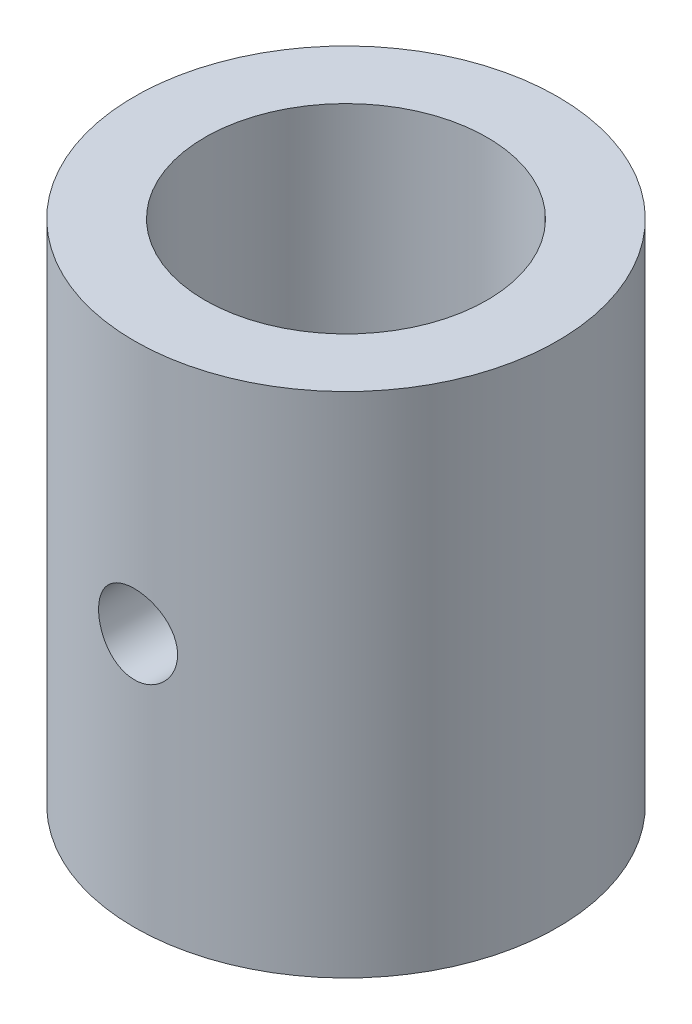
ISO-10303-21;
HEADER;
FILE_DESCRIPTION(('STEP AP214'),'2;1');
FILE_NAME('part.step','',(''),(''),'','','');
FILE_SCHEMA(('AUTOMOTIVE_DESIGN { 1 0 10303 214 1 1 1 1 }'));
ENDSEC;
DATA;
#1=APPLICATION_CONTEXT('core data for automotive mechanical design processes');
#2=APPLICATION_PROTOCOL_DEFINITION('international standard','automotive_design',2000,#1);
#3=PRODUCT_CONTEXT('',#1,'mechanical');
#4=PRODUCT('Part','Part','',(#3));
#5=PRODUCT_RELATED_PRODUCT_CATEGORY('part','',(#4));
#6=PRODUCT_DEFINITION_FORMATION('','',#4);
#7=PRODUCT_DEFINITION_CONTEXT('part definition',#1,'design');
#8=PRODUCT_DEFINITION('design','',#6,#7);
#9=PRODUCT_DEFINITION_SHAPE('','',#8);
#10=(LENGTH_UNIT() NAMED_UNIT(*) SI_UNIT(.MILLI.,.METRE.));
#11=(NAMED_UNIT(*) PLANE_ANGLE_UNIT() SI_UNIT($,.RADIAN.));
#12=(NAMED_UNIT(*) SI_UNIT($,.STERADIAN.) SOLID_ANGLE_UNIT());
#13=UNCERTAINTY_MEASURE_WITH_UNIT(LENGTH_MEASURE(1.E-05),#10,'distance_accuracy_value','');
#14=(GEOMETRIC_REPRESENTATION_CONTEXT(3) GLOBAL_UNCERTAINTY_ASSIGNED_CONTEXT((#13)) GLOBAL_UNIT_ASSIGNED_CONTEXT((#10,
#11,#12)) REPRESENTATION_CONTEXT('',''));
#15=CARTESIAN_POINT('',(0.,0.,0.));
#16=DIRECTION('',(0.,0.,1.));
#17=DIRECTION('',(1.,0.,0.));
#18=AXIS2_PLACEMENT_3D('',#15,#16,#17);
#19=CARTESIAN_POINT('',(0.,11.43,0.));
#20=DIRECTION('',(0.,1.,0.));
#21=DIRECTION('',(0.,0.,1.));
#22=AXIS2_PLACEMENT_3D('',#19,#20,#21);
#23=PLANE('',#22);
#24=CARTESIAN_POINT('',(0.,11.43,0.));
#25=DIRECTION('',(0.,1.,0.));
#26=DIRECTION('',(0.,0.,1.));
#27=AXIS2_PLACEMENT_3D('',#24,#25,#26);
#28=CIRCLE('',#27,4.7625);
#29=CARTESIAN_POINT('',(0.,11.43,4.7625));
#30=VERTEX_POINT('',#29);
#31=EDGE_CURVE('E60',#30,#30,#28,.T.);
#32=ORIENTED_EDGE('',*,*,#31,.T.);
#33=EDGE_LOOP('',(#32));
#34=FACE_BOUND('',#33,.T.);
#35=CARTESIAN_POINT('',(0.,11.43,0.));
#36=DIRECTION('',(0.,1.,0.));
#37=DIRECTION('',(0.,0.,1.));
#38=AXIS2_PLACEMENT_3D('',#35,#36,#37);
#39=CIRCLE('',#38,3.175);
#40=CARTESIAN_POINT('',(0.,11.43,3.175));
#41=VERTEX_POINT('',#40);
#42=EDGE_CURVE('E69',#41,#41,#39,.T.);
#43=ORIENTED_EDGE('',*,*,#42,.F.);
#44=EDGE_LOOP('',(#43));
#45=FACE_BOUND('',#44,.T.);
#46=ADVANCED_FACE('F48',(#34,#45),#23,.T.);
#47=CARTESIAN_POINT('',(0.,0.,0.));
#48=DIRECTION('',(0.,1.,0.));
#49=DIRECTION('',(0.,0.,1.));
#50=AXIS2_PLACEMENT_3D('',#47,#48,#49);
#51=PLANE('',#50);
#52=CARTESIAN_POINT('',(0.,0.,0.));
#53=DIRECTION('',(0.,1.,0.));
#54=DIRECTION('',(0.,0.,1.));
#55=AXIS2_PLACEMENT_3D('',#52,#53,#54);
#56=CIRCLE('',#55,4.7625);
#57=CARTESIAN_POINT('',(0.,0.,4.7625));
#58=VERTEX_POINT('',#57);
#59=EDGE_CURVE('E64',#58,#58,#56,.T.);
#60=ORIENTED_EDGE('',*,*,#59,.F.);
#61=EDGE_LOOP('',(#60));
#62=FACE_BOUND('',#61,.T.);
#63=CARTESIAN_POINT('',(0.,0.,0.));
#64=DIRECTION('',(0.,1.,0.));
#65=DIRECTION('',(0.,0.,1.));
#66=AXIS2_PLACEMENT_3D('',#63,#64,#65);
#67=CIRCLE('',#66,3.175);
#68=CARTESIAN_POINT('',(0.,0.,3.175));
#69=VERTEX_POINT('',#68);
#70=EDGE_CURVE('E71',#69,#69,#67,.T.);
#71=ORIENTED_EDGE('',*,*,#70,.T.);
#72=EDGE_LOOP('',(#71));
#73=FACE_BOUND('',#72,.T.);
#74=ADVANCED_FACE('F97',(#62,#73),#51,.F.);
#75=CARTESIAN_POINT('',(0.,11.43,0.));
#76=DIRECTION('',(0.,-1.,0.));
#77=DIRECTION('',(0.,0.,-1.));
#78=AXIS2_PLACEMENT_3D('',#75,#76,#77);
#79=CYLINDRICAL_SURFACE('',#78,4.7625);
#80=CARTESIAN_POINT('',(0.888999999999998,5.715,4.67879100302632));
#81=CARTESIAN_POINT('',(0.888998098445171,5.66553347668564,4.67879195841527));
#82=CARTESIAN_POINT('',(0.88485730336254,5.61604223488563,4.67958399908421));
#83=CARTESIAN_POINT('',(0.868414529128927,5.51845499527168,4.68266268115182));
#84=CARTESIAN_POINT('',(0.856105601404332,5.47036022181407,4.684950595055));
#85=CARTESIAN_POINT('',(0.823717494732676,5.37699205552519,4.69075307822151));
#86=CARTESIAN_POINT('',(0.80364552247046,5.33171609102787,4.69426650950153));
#87=CARTESIAN_POINT('',(0.756320137930824,5.24517715230167,4.70212280443796));
#88=CARTESIAN_POINT('',(0.729067296399487,5.20391385949641,4.70646560216757));
#89=CARTESIAN_POINT('',(0.667795421227265,5.12605939504138,4.71555114613642));
#90=CARTESIAN_POINT('',(0.633704924295417,5.08952491088527,4.72029778274882));
#91=CARTESIAN_POINT('',(0.559879890365205,5.02265898273362,4.72962180903198));
#92=CARTESIAN_POINT('',(0.520144984685527,4.99232794425054,4.73419918762253));
#93=CARTESIAN_POINT('',(0.435786932235462,4.93851285619169,4.74271060562743));
#94=CARTESIAN_POINT('',(0.391129147181685,4.91508222530554,4.74663952739874));
#95=CARTESIAN_POINT('',(0.298425442330767,4.87607718812993,4.75336781307649));
#96=CARTESIAN_POINT('',(0.250379798981758,4.86050214167096,4.75616726902195));
#97=CARTESIAN_POINT('',(0.152851572521078,4.83782560359291,4.7602937225472));
#98=CARTESIAN_POINT('',(0.103391919405878,4.83062856265536,4.76163731149307));
#99=CARTESIAN_POINT('',(0.00395012265651175,4.82461464102688,4.76275782343214));
#100=CARTESIAN_POINT('',(-0.0460319765081533,4.82579705280208,4.76253487869839));
#101=CARTESIAN_POINT('',(-0.144444671688842,4.83643514057962,4.76056041584804));
#102=CARTESIAN_POINT('',(-0.192886825240841,4.84578793575446,4.75882790674693));
#103=CARTESIAN_POINT('',(-0.287501862571594,4.87233861429558,4.75405029645821));
#104=CARTESIAN_POINT('',(-0.33367466412465,4.88953678169235,4.75100514774859));
#105=CARTESIAN_POINT('',(-0.422739054433712,4.93138821568746,4.74391261768337));
#106=CARTESIAN_POINT('',(-0.465610835889803,4.9560826619247,4.73985972326428));
#107=CARTESIAN_POINT('',(-0.54664050718777,5.01219533354,4.73119999672601));
#108=CARTESIAN_POINT('',(-0.584797921126748,5.04361423686087,4.72659310877513));
#109=CARTESIAN_POINT('',(-0.655925198514459,5.11285103926185,4.71725311552894));
#110=CARTESIAN_POINT('',(-0.688807398184767,5.15075894158584,4.71251915609911));
#111=CARTESIAN_POINT('',(-0.747760533101214,5.23159771318606,4.70352553264342));
#112=CARTESIAN_POINT('',(-0.773831370420337,5.27452865466573,4.69926587543712));
#113=CARTESIAN_POINT('',(-0.818446393711913,5.36431047192384,4.69170194113279));
#114=CARTESIAN_POINT('',(-0.836977931458656,5.41116777724299,4.68839927216456));
#115=CARTESIAN_POINT('',(-0.865880716779779,5.50740634908037,4.68314795491143));
#116=CARTESIAN_POINT('',(-0.876252880144654,5.55678733168378,4.68119915467412));
#117=CARTESIAN_POINT('',(-0.888414686671061,5.65588126672206,4.6789062599473));
#118=CARTESIAN_POINT('',(-0.890330234914563,5.70557823809696,4.67853862663147));
#119=CARTESIAN_POINT('',(-0.885861855949336,5.80458195385271,4.67938671308219));
#120=CARTESIAN_POINT('',(-0.879478335344783,5.85388871723231,4.68060235527782));
#121=CARTESIAN_POINT('',(-0.858701078754881,5.95029904442564,4.68445810156974));
#122=CARTESIAN_POINT('',(-0.844373266273912,5.99741732649724,4.68708647706651));
#123=CARTESIAN_POINT('',(-0.80818405383386,6.08858442946453,4.69346144437816));
#124=CARTESIAN_POINT('',(-0.786322102929268,6.13263302560142,4.69720811796763));
#125=CARTESIAN_POINT('',(-0.735395103984225,6.21696528749205,4.70545117457588));
#126=CARTESIAN_POINT('',(-0.706250471736708,6.25720008778688,4.70995564808318));
#127=CARTESIAN_POINT('',(-0.641692815727329,6.33225361713345,4.71918396772417));
#128=CARTESIAN_POINT('',(-0.606279233583189,6.36707186320726,4.72390783337168));
#129=CARTESIAN_POINT('',(-0.529626798803019,6.43077385351156,4.73311826717778));
#130=CARTESIAN_POINT('',(-0.488317048626905,6.45957295101681,4.73760086700151));
#131=CARTESIAN_POINT('',(-0.401372446217216,6.50982193100337,4.74575706169154));
#132=CARTESIAN_POINT('',(-0.355737759545788,6.53127209466299,4.74943068750815));
#133=CARTESIAN_POINT('',(-0.261673302564475,6.56608739023516,4.75553794272695));
#134=CARTESIAN_POINT('',(-0.213259392915785,6.57949420604545,4.75797795467165));
#135=CARTESIAN_POINT('',(-0.114817221924449,6.59797531726989,4.76137027592575));
#136=CARTESIAN_POINT('',(-0.0647891294262397,6.60305048131693,4.76232274032187));
#137=CARTESIAN_POINT('',(0.0346493103114121,6.60469420200498,4.76262960328222));
#138=CARTESIAN_POINT('',(0.0840575149749189,6.60139064393343,4.76200802681752));
#139=CARTESIAN_POINT('',(0.181601751526366,6.58665063946222,4.75928653611926));
#140=CARTESIAN_POINT('',(0.229737795373829,6.57521426954695,4.75718663578848));
#141=CARTESIAN_POINT('',(0.323304498311178,6.54458696949523,4.75174438830884));
#142=CARTESIAN_POINT('',(0.368739709487063,6.52540953760029,4.74840420467422));
#143=CARTESIAN_POINT('',(0.455766568912328,6.47985977173752,4.74084309940475));
#144=CARTESIAN_POINT('',(0.497357962472827,6.45348696146546,4.7366221194692));
#145=CARTESIAN_POINT('',(0.576154121271737,6.39385431395836,4.72768964542386));
#146=CARTESIAN_POINT('',(0.613288238728777,6.36050203053772,4.72297203905049));
#147=CARTESIAN_POINT('',(0.681477028379084,6.28804911864145,4.71361674634188));
#148=CARTESIAN_POINT('',(0.712530269101397,6.24894714044084,4.70897907905848));
#149=CARTESIAN_POINT('',(0.767942766880938,6.16567654699838,4.70026237275925));
#150=CARTESIAN_POINT('',(0.792238122041419,6.12146481453625,4.69618883808499));
#151=CARTESIAN_POINT('',(0.833017792675173,6.02952562839043,4.68912779075801));
#152=CARTESIAN_POINT('',(0.849509499458029,5.98180155118129,4.68613925106774));
#153=CARTESIAN_POINT('',(0.870852312023784,5.89744551767374,4.68221139362582));
#154=CARTESIAN_POINT('',(0.877646063184972,5.86130819250357,4.6809363436638));
#155=CARTESIAN_POINT('',(0.886720552745196,5.78845177790845,4.67922580488531));
#156=CARTESIAN_POINT('',(0.889001412050939,5.75173270409593,4.67879029357642));
#157=CARTESIAN_POINT('',(0.888999999999998,5.715,4.67879100302632));
#158=B_SPLINE_CURVE_WITH_KNOTS('',3,(#80,#81,#82,#83,#84,#85,#86,#87,#88,#89,#90,#91,#92,#93,
#94,#95,#96,#97,#98,#99,#100,#101,#102,#103,#104,#105,#106,#107,#108,#109,#110,#111,#112,#113,
#114,#115,#116,#117,#118,#119,#120,#121,#122,#123,#124,#125,#126,#127,#128,#129,#130,#131,#132,
#133,#134,#135,#136,#137,#138,#139,#140,#141,#142,#143,#144,#145,#146,#147,#148,#149,#150,#151,
#152,#153,#154,#155,#156,#157),.UNSPECIFIED.,.T.,.F.,(4,2,2,2,2,2,2,2,2,2,2,2,2,2,2,2,2,2,2,2,2,
2,2,2,2,2,2,2,2,2,2,2,2,2,2,2,2,2,4),(0.,0.148265150207036,0.296656590513096,0.44491060363455,
0.59315283686092,0.743033736199193,0.892924429958793,1.04394669541705,1.19495665173683,
1.34422695591601,1.49348465634372,1.64088957402269,1.7882998287099,1.93653498038651,
2.08478508380334,2.23528852157597,2.38579412301876,2.53655118759958,2.6872913291191,
2.83577946149703,2.98426031912878,3.13152710094102,3.27880465415007,3.4277679838393,
3.57674458853882,3.72769299958471,3.87863563453276,4.02878911013782,4.1789269301997,
4.32678701582149,4.47464571092294,4.62224768806008,4.76985943820799,4.91956651086577,
5.06930878311598,5.22042227120686,5.3713923426074,5.48149358769334,5.5915918829724),.UNSPECIFIED.);
#159=CARTESIAN_POINT('',(0.888999999999998,5.715,4.67879100302632));
#160=VERTEX_POINT('',#159);
#161=EDGE_CURVE('E10',#160,#160,#158,.T.);
#162=ORIENTED_EDGE('',*,*,#161,.T.);
#163=EDGE_LOOP('',(#162));
#164=FACE_BOUND('',#163,.T.);
#165=ORIENTED_EDGE('',*,*,#31,.F.);
#166=EDGE_LOOP('',(#165));
#167=FACE_BOUND('',#166,.T.);
#168=ORIENTED_EDGE('',*,*,#59,.T.);
#169=EDGE_LOOP('',(#168));
#170=FACE_BOUND('',#169,.T.);
#171=ADVANCED_FACE('F50',(#164,#167,#170),#79,.T.);
#172=CARTESIAN_POINT('',(0.,11.43,0.));
#173=DIRECTION('',(0.,-1.,0.));
#174=DIRECTION('',(0.,0.,-1.));
#175=AXIS2_PLACEMENT_3D('',#172,#173,#174);
#176=CYLINDRICAL_SURFACE('',#175,3.175);
#177=CARTESIAN_POINT('',(0.888999999999998,5.715,3.048));
#178=CARTESIAN_POINT('',(0.888999022704973,5.66612663453629,3.04800074144579));
#179=CARTESIAN_POINT('',(0.884956005900079,5.61724326359377,3.0491883536904));
#180=CARTESIAN_POINT('',(0.868925614211579,5.52089501510118,3.05379446473852));
#181=CARTESIAN_POINT('',(0.856934779420125,5.47343076474305,3.05721393512249));
#182=CARTESIAN_POINT('',(0.825439260264912,5.38132876820394,3.06586679255467));
#183=CARTESIAN_POINT('',(0.805945880627881,5.33668688658228,3.07109744934926));
#184=CARTESIAN_POINT('',(0.760034756365592,5.25129847887175,3.08277975485952));
#185=CARTESIAN_POINT('',(0.733616275257373,5.21055236772657,3.0892315334209));
#186=CARTESIAN_POINT('',(0.67382564922352,5.13298885522836,3.10282851808415));
#187=CARTESIAN_POINT('',(0.640296533333317,5.09629475789265,3.10998700385331));
#188=CARTESIAN_POINT('',(0.567573542210274,5.02897006565009,3.12407666925912));
#189=CARTESIAN_POINT('',(0.528379028524613,4.99834015506006,3.13100782316883));
#190=CARTESIAN_POINT('',(0.444574237503612,4.94349093918784,3.14401109305889));
#191=CARTESIAN_POINT('',(0.399879985189846,4.91939543398182,3.15006572408435));
#192=CARTESIAN_POINT('',(0.306876342799878,4.87910847551534,3.16048064645674));
#193=CARTESIAN_POINT('',(0.258567629420827,4.86291554698866,3.16484125401579));
#194=CARTESIAN_POINT('',(0.160994613397914,4.83929593680741,3.17128288506878));
#195=CARTESIAN_POINT('',(0.111784817223568,4.83165922133937,3.17341843142117));
#196=CARTESIAN_POINT('',(0.0127392624770643,4.82470672566935,3.17536048694193));
#197=CARTESIAN_POINT('',(-0.0370963793271482,4.82538941564482,3.17516742430905));
#198=CARTESIAN_POINT('',(-0.134512605209552,4.83491111727202,3.17251342098985));
#199=CARTESIAN_POINT('',(-0.182117374688842,4.84352301112564,3.17011563326431));
#200=CARTESIAN_POINT('',(-0.275176901920623,4.86829016997374,3.16339697389186));
#201=CARTESIAN_POINT('',(-0.320631531013264,4.88444588574731,3.15907598732543));
#202=CARTESIAN_POINT('',(-0.408664749201555,4.92400818327181,3.14890524255914));
#203=CARTESIAN_POINT('',(-0.451207592285722,4.9474900835393,3.14303970776309));
#204=CARTESIAN_POINT('',(-0.531824617738518,5.00097973637356,3.1304081222126));
#205=CARTESIAN_POINT('',(-0.569897850736413,5.03098887151466,3.12364188079185));
#206=CARTESIAN_POINT('',(-0.641850826998314,5.09787632677098,3.10966917671264));
#207=CARTESIAN_POINT('',(-0.675545670788151,5.1349523006038,3.1024555637627));
#208=CARTESIAN_POINT('',(-0.736287397269027,5.21430194393134,3.08860471608588));
#209=CARTESIAN_POINT('',(-0.763333783924001,5.25657600089809,3.0819675243892));
#210=CARTESIAN_POINT('',(-0.810171227980406,5.34555559029839,3.06999005425627));
#211=CARTESIAN_POINT('',(-0.829907105431933,5.39229160542245,3.06465973815351));
#212=CARTESIAN_POINT('',(-0.861178446006269,5.48860580067821,3.05602075215966));
#213=CARTESIAN_POINT('',(-0.87271618553704,5.53818318770017,3.05271152110212));
#214=CARTESIAN_POINT('',(-0.886934699344588,5.63703159017426,3.04861036820764));
#215=CARTESIAN_POINT('',(-0.889893331949963,5.68625940356027,3.04773950623862));
#216=CARTESIAN_POINT('',(-0.8876392469048,5.78450738744956,3.04839680667467));
#217=CARTESIAN_POINT('',(-0.882427501789492,5.8335275819697,3.04992468355344));
#218=CARTESIAN_POINT('',(-0.864226581903411,5.9288646607334,3.0551305705055));
#219=CARTESIAN_POINT('',(-0.851408976918569,5.97521714844924,3.05876110757367));
#220=CARTESIAN_POINT('',(-0.818555399608298,6.06511307476355,3.06771577424975));
#221=CARTESIAN_POINT('',(-0.798518415218365,6.10865611850437,3.07304014129867));
#222=CARTESIAN_POINT('',(-0.751245255343619,6.19284710865841,3.08494108557681));
#223=CARTESIAN_POINT('',(-0.723848410491957,6.23340094694302,3.09154455793357));
#224=CARTESIAN_POINT('',(-0.66282910075005,6.30943753199222,3.10519857691837));
#225=CARTESIAN_POINT('',(-0.629205341400973,6.34491922162969,3.11224921630329));
#226=CARTESIAN_POINT('',(-0.555393175540638,6.41098152081625,3.12627846255595));
#227=CARTESIAN_POINT('',(-0.515027982119801,6.44136708908717,3.13324740753382));
#228=CARTESIAN_POINT('',(-0.429610615302621,6.49493365124605,3.14609634169483));
#229=CARTESIAN_POINT('',(-0.384558689701355,6.51811502577321,3.15197638840411));
#230=CARTESIAN_POINT('',(-0.291361546194213,6.55639584286503,3.16194727289417));
#231=CARTESIAN_POINT('',(-0.243242948857278,6.57155640914173,3.16605159772319));
#232=CARTESIAN_POINT('',(-0.145007590278839,6.59353595714912,3.17206811720327));
#233=CARTESIAN_POINT('',(-0.094891324161077,6.600356992727,3.17398085158866));
#234=CARTESIAN_POINT('',(0.00410257465857416,6.6053243537648,3.17537031148508));
#235=CARTESIAN_POINT('',(0.0529649880377281,6.60375544204589,3.17492700643421));
#236=CARTESIAN_POINT('',(0.149702046305524,6.59265619548637,3.17183800207679));
#237=CARTESIAN_POINT('',(0.19757673517122,6.58312621588844,3.1691924010422));
#238=CARTESIAN_POINT('',(0.290599820702144,6.55654269909031,3.1620147320988));
#239=CARTESIAN_POINT('',(0.335767515655421,6.53955213732754,3.15749847230393));
#240=CARTESIAN_POINT('',(0.42263640010766,6.49858576124797,3.14704937045711));
#241=CARTESIAN_POINT('',(0.464337066141581,6.47460889456549,3.14111631501379));
#242=CARTESIAN_POINT('',(0.544392318898716,6.4195464707499,3.12825099335539));
#243=CARTESIAN_POINT('',(0.582615836411657,6.38827595720878,3.12129485795685));
#244=CARTESIAN_POINT('',(0.653368888845673,6.31985774445172,3.10725567651361));
#245=CARTESIAN_POINT('',(0.685896870100548,6.28270844682702,3.10017259641915));
#246=CARTESIAN_POINT('',(0.745143293434855,6.20247378490072,3.08647631222338));
#247=CARTESIAN_POINT('',(0.771696671947966,6.1592635144346,3.07987922601124));
#248=CARTESIAN_POINT('',(0.817126280627679,6.06881269037465,3.0681400998246));
#249=CARTESIAN_POINT('',(0.83600703458514,6.0215745315665,3.06299720300363));
#250=CARTESIAN_POINT('',(0.863376907077113,5.93133059364904,3.05538486849526));
#251=CARTESIAN_POINT('',(0.872961556556878,5.88867747887887,3.05263934900825));
#252=CARTESIAN_POINT('',(0.885773084342431,5.80235214216532,3.0489467122479));
#253=CARTESIAN_POINT('',(0.889000873447363,5.7586800671241,3.04799933734046));
#254=CARTESIAN_POINT('',(0.888999999999998,5.715,3.048));
#255=B_SPLINE_CURVE_WITH_KNOTS('',3,(#177,#178,#179,#180,#181,#182,#183,#184,#185,#186,#187,
#188,#189,#190,#191,#192,#193,#194,#195,#196,#197,#198,#199,#200,#201,#202,#203,#204,#205,#206,
#207,#208,#209,#210,#211,#212,#213,#214,#215,#216,#217,#218,#219,#220,#221,#222,#223,#224,#225,
#226,#227,#228,#229,#230,#231,#232,#233,#234,#235,#236,#237,#238,#239,#240,#241,#242,#243,#244,
#245,#246,#247,#248,#249,#250,#251,#252,#253,#254),.UNSPECIFIED.,.T.,.F.,(4,2,2,2,2,2,2,2,2,2,2,
2,2,2,2,2,2,2,2,2,2,2,2,2,2,2,2,2,2,2,2,2,2,2,2,2,2,2,4),(0.,0.146459287401066,0.29298237454487,
0.439285541729896,0.585604274540446,0.735571650820726,0.885555940626633,1.03820968127062,
1.19083491334784,1.33962536162132,1.48838844982117,1.63301874819051,1.77765769001138,
1.92383555425299,2.07004441154514,2.22118784811516,2.37234255795563,2.52461599929671,
2.67684714175449,2.82408956362906,2.97131446029549,3.11533822325339,3.25938218435845,
3.40687004300794,3.55438859610561,3.70666622842305,3.85893581366484,4.01002765448381,
4.16108227712869,4.30704320227679,4.45299761463258,4.59774301104064,4.74251022211429,
4.89144959773004,5.04042953893496,5.19312385990268,5.34572802099168,5.47664325964221,
5.60753973963555),.UNSPECIFIED.);
#256=CARTESIAN_POINT('',(0.888999999999998,5.715,3.048));
#257=VERTEX_POINT('',#256);
#258=EDGE_CURVE('E74',#257,#257,#255,.T.);
#259=ORIENTED_EDGE('',*,*,#258,.F.);
#260=EDGE_LOOP('',(#259));
#261=FACE_BOUND('',#260,.T.);
#262=ORIENTED_EDGE('',*,*,#42,.T.);
#263=EDGE_LOOP('',(#262));
#264=FACE_BOUND('',#263,.T.);
#265=ORIENTED_EDGE('',*,*,#70,.F.);
#266=EDGE_LOOP('',(#265));
#267=FACE_BOUND('',#266,.T.);
#268=ADVANCED_FACE('F82',(#261,#264,#267),#176,.F.);
#269=CARTESIAN_POINT('',(0.,5.715,4.7625));
#270=DIRECTION('',(0.,0.,1.));
#271=DIRECTION('',(1.,0.,0.));
#272=AXIS2_PLACEMENT_3D('',#269,#270,#271);
#273=CYLINDRICAL_SURFACE('',#272,0.888999999999997);
#274=ORIENTED_EDGE('',*,*,#258,.T.);
#275=EDGE_LOOP('',(#274));
#276=FACE_BOUND('',#275,.T.);
#277=ORIENTED_EDGE('',*,*,#161,.F.);
#278=EDGE_LOOP('',(#277));
#279=FACE_BOUND('',#278,.T.);
#280=ADVANCED_FACE('F85',(#276,#279),#273,.F.);
#281=CLOSED_SHELL('',(#46,#74,#171,#268,#280));
#282=MANIFOLD_SOLID_BREP('B2',#281);
#283=ADVANCED_BREP_SHAPE_REPRESENTATION('',(#18,#282),#14);
#284=SHAPE_DEFINITION_REPRESENTATION(#9,#283);
ENDSEC;
END-ISO-10303-21;
